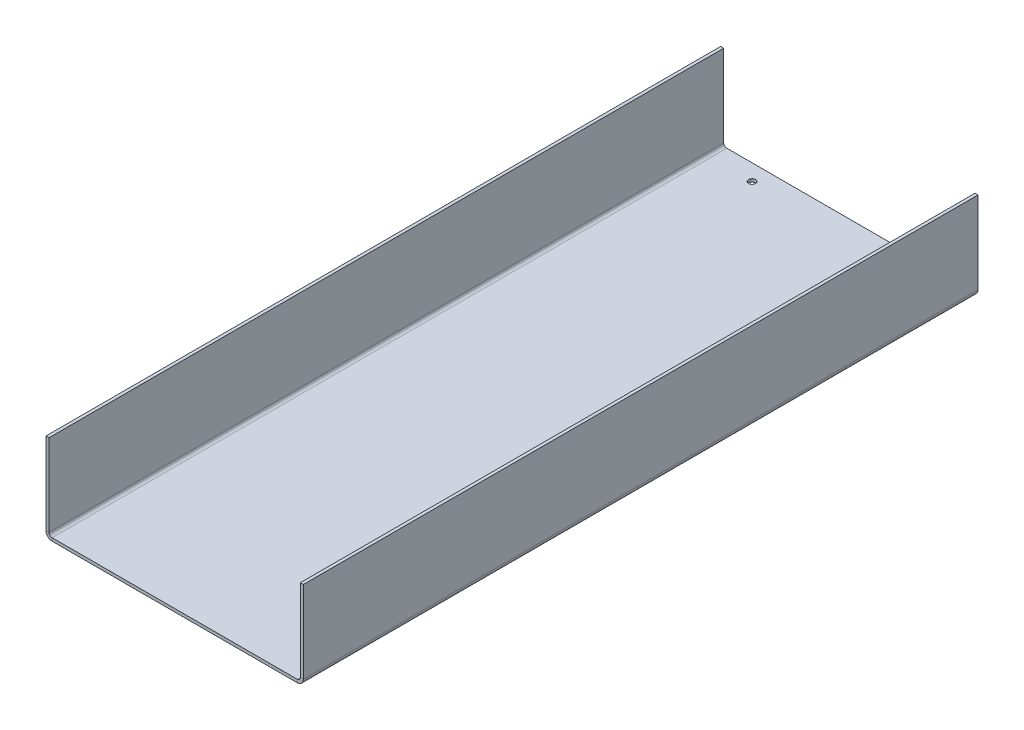
ISO-10303-21;
HEADER;
FILE_DESCRIPTION(('STEP AP214'),'2;1');
FILE_NAME('part.step','',(''),(''),'','','');
FILE_SCHEMA(('AUTOMOTIVE_DESIGN { 1 0 10303 214 1 1 1 1 }'));
ENDSEC;
DATA;
#1=APPLICATION_CONTEXT('core data for automotive mechanical design processes');
#2=APPLICATION_PROTOCOL_DEFINITION('international standard','automotive_design',2000,#1);
#3=PRODUCT_CONTEXT('',#1,'mechanical');
#4=PRODUCT('Part','Part','',(#3));
#5=PRODUCT_RELATED_PRODUCT_CATEGORY('part','',(#4));
#6=PRODUCT_DEFINITION_FORMATION('','',#4);
#7=PRODUCT_DEFINITION_CONTEXT('part definition',#1,'design');
#8=PRODUCT_DEFINITION('design','',#6,#7);
#9=PRODUCT_DEFINITION_SHAPE('','',#8);
#10=(LENGTH_UNIT() NAMED_UNIT(*) SI_UNIT(.MILLI.,.METRE.));
#11=(NAMED_UNIT(*) PLANE_ANGLE_UNIT() SI_UNIT($,.RADIAN.));
#12=(NAMED_UNIT(*) SI_UNIT($,.STERADIAN.) SOLID_ANGLE_UNIT());
#13=UNCERTAINTY_MEASURE_WITH_UNIT(LENGTH_MEASURE(1.E-05),#10,'distance_accuracy_value','');
#14=(GEOMETRIC_REPRESENTATION_CONTEXT(3) GLOBAL_UNCERTAINTY_ASSIGNED_CONTEXT((#13)) GLOBAL_UNIT_ASSIGNED_CONTEXT((#10,
#11,#12)) REPRESENTATION_CONTEXT('',''));
#15=CARTESIAN_POINT('',(0.,0.,0.));
#16=DIRECTION('',(0.,0.,1.));
#17=DIRECTION('',(1.,0.,0.));
#18=AXIS2_PLACEMENT_3D('',#15,#16,#17);
#19=CARTESIAN_POINT('',(-60.5,1.5,125.));
#20=DIRECTION('',(0.,0.,1.));
#21=DIRECTION('',(1.,0.,0.));
#22=AXIS2_PLACEMENT_3D('',#19,#20,#21);
#23=PLANE('',#22);
#24=DIRECTION('',(0.,-1.,0.));
#25=VECTOR('',#24,1.);
#26=CARTESIAN_POINT('',(-60.5,1.5,125.));
#27=LINE('',#26,#25);
#28=CARTESIAN_POINT('',(-60.5,1.5,125.));
#29=VERTEX_POINT('',#28);
#30=CARTESIAN_POINT('',(-60.5,0.,125.));
#31=VERTEX_POINT('',#30);
#32=EDGE_CURVE('E11',#29,#31,#27,.T.);
#33=ORIENTED_EDGE('',*,*,#32,.F.);
#34=CARTESIAN_POINT('',(-60.5,3.00000000000001,125.));
#35=DIRECTION('',(0.,0.,-1.));
#36=DIRECTION('',(-1.,0.,0.));
#37=AXIS2_PLACEMENT_3D('',#34,#35,#36);
#38=CIRCLE('',#37,1.5);
#39=CARTESIAN_POINT('',(-62.,3.00000000000004,125.));
#40=VERTEX_POINT('',#39);
#41=EDGE_CURVE('E203',#40,#29,#38,.F.);
#42=ORIENTED_EDGE('',*,*,#41,.F.);
#43=DIRECTION('',(1.,0.,0.));
#44=VECTOR('',#43,1.);
#45=CARTESIAN_POINT('',(-63.5,3.00000000000007,125.));
#46=LINE('',#45,#44);
#47=CARTESIAN_POINT('',(-63.5,3.00000000000007,125.));
#48=VERTEX_POINT('',#47);
#49=EDGE_CURVE('E49',#48,#40,#46,.T.);
#50=ORIENTED_EDGE('',*,*,#49,.F.);
#51=CARTESIAN_POINT('',(-60.5,3.00000000000001,125.));
#52=DIRECTION('',(0.,0.,1.));
#53=DIRECTION('',(1.,0.,0.));
#54=AXIS2_PLACEMENT_3D('',#51,#52,#53);
#55=CIRCLE('',#54,3.);
#56=EDGE_CURVE('E216',#48,#31,#55,.T.);
#57=ORIENTED_EDGE('',*,*,#56,.T.);
#58=EDGE_LOOP('',(#33,#42,#50,#57));
#59=FACE_BOUND('',#58,.T.);
#60=ADVANCED_FACE('F43',(#59),#23,.T.);
#61=CARTESIAN_POINT('',(-63.5,3.00000000000007,125.));
#62=DIRECTION('',(0.,0.,1.));
#63=DIRECTION('',(1.,0.,0.));
#64=AXIS2_PLACEMENT_3D('',#61,#62,#63);
#65=PLANE('',#64);
#66=DIRECTION('',(1.,0.,0.));
#67=VECTOR('',#66,1.);
#68=CARTESIAN_POINT('',(-62.,1.5,125.));
#69=LINE('',#68,#67);
#70=CARTESIAN_POINT('',(60.5,1.5,125.));
#71=VERTEX_POINT('',#70);
#72=EDGE_CURVE('E204',#29,#71,#69,.T.);
#73=ORIENTED_EDGE('',*,*,#72,.F.);
#74=ORIENTED_EDGE('',*,*,#32,.T.);
#75=DIRECTION('',(1.,0.,0.));
#76=VECTOR('',#75,1.);
#77=CARTESIAN_POINT('',(-62.,0.,125.));
#78=LINE('',#77,#76);
#79=CARTESIAN_POINT('',(60.5,0.,125.));
#80=VERTEX_POINT('',#79);
#81=EDGE_CURVE('E218',#31,#80,#78,.T.);
#82=ORIENTED_EDGE('',*,*,#81,.T.);
#83=DIRECTION('',(0.,1.,0.));
#84=VECTOR('',#83,1.);
#85=CARTESIAN_POINT('',(60.5,0.,125.));
#86=LINE('',#85,#84);
#87=EDGE_CURVE('E61',#80,#71,#86,.T.);
#88=ORIENTED_EDGE('',*,*,#87,.T.);
#89=EDGE_LOOP('',(#73,#74,#82,#88));
#90=FACE_BOUND('',#89,.T.);
#91=ADVANCED_FACE('F294',(#90),#65,.T.);
#92=CARTESIAN_POINT('',(-62.,3.00000000000004,-208.0001));
#93=DIRECTION('',(0.,0.,-1.));
#94=DIRECTION('',(-1.,0.,0.));
#95=AXIS2_PLACEMENT_3D('',#92,#93,#94);
#96=PLANE('',#95);
#97=DIRECTION('',(-1.,0.,0.));
#98=VECTOR('',#97,1.);
#99=CARTESIAN_POINT('',(-62.,3.00000000000004,-208.0001));
#100=LINE('',#99,#98);
#101=CARTESIAN_POINT('',(-62.,3.00000000000004,-208.0001));
#102=VERTEX_POINT('',#101);
#103=CARTESIAN_POINT('',(-63.5,3.00000000000007,-208.0001));
#104=VERTEX_POINT('',#103);
#105=EDGE_CURVE('E260',#102,#104,#100,.T.);
#106=ORIENTED_EDGE('',*,*,#105,.F.);
#107=CARTESIAN_POINT('',(-60.5,3.00000000000001,-208.0001));
#108=DIRECTION('',(0.,0.,-1.));
#109=DIRECTION('',(-1.,0.,0.));
#110=AXIS2_PLACEMENT_3D('',#107,#108,#109);
#111=CIRCLE('',#110,1.5);
#112=CARTESIAN_POINT('',(-60.5,1.5,-208.0001));
#113=VERTEX_POINT('',#112);
#114=EDGE_CURVE('E175',#102,#113,#111,.F.);
#115=ORIENTED_EDGE('',*,*,#114,.T.);
#116=DIRECTION('',(0.,1.,0.));
#117=VECTOR('',#116,1.);
#118=CARTESIAN_POINT('',(-60.5,0.,-208.0001));
#119=LINE('',#118,#117);
#120=CARTESIAN_POINT('',(-60.5,0.,-208.0001));
#121=VERTEX_POINT('',#120);
#122=EDGE_CURVE('E253',#121,#113,#119,.T.);
#123=ORIENTED_EDGE('',*,*,#122,.F.);
#124=CARTESIAN_POINT('',(-60.5,3.00000000000001,-208.0001));
#125=DIRECTION('',(0.,0.,1.));
#126=DIRECTION('',(1.,0.,0.));
#127=AXIS2_PLACEMENT_3D('',#124,#125,#126);
#128=CIRCLE('',#127,3.);
#129=EDGE_CURVE('E183',#104,#121,#128,.T.);
#130=ORIENTED_EDGE('',*,*,#129,.F.);
#131=EDGE_LOOP('',(#106,#115,#123,#130));
#132=FACE_BOUND('',#131,.T.);
#133=ADVANCED_FACE('F301',(#132),#96,.T.);
#134=CARTESIAN_POINT('',(-60.5,0.,-208.0001));
#135=DIRECTION('',(0.,0.,-1.));
#136=DIRECTION('',(-1.,0.,0.));
#137=AXIS2_PLACEMENT_3D('',#134,#135,#136);
#138=PLANE('',#137);
#139=DIRECTION('',(0.,-1.,0.));
#140=VECTOR('',#139,1.);
#141=CARTESIAN_POINT('',(-62.,43.5,-208.0001));
#142=LINE('',#141,#140);
#143=CARTESIAN_POINT('',(-62.,43.5,-208.0001));
#144=VERTEX_POINT('',#143);
#145=EDGE_CURVE('E174',#144,#102,#142,.T.);
#146=ORIENTED_EDGE('',*,*,#145,.T.);
#147=ORIENTED_EDGE('',*,*,#105,.T.);
#148=DIRECTION('',(0.,1.,0.));
#149=VECTOR('',#148,1.);
#150=CARTESIAN_POINT('',(-63.5,43.5,-208.0001));
#151=LINE('',#150,#149);
#152=CARTESIAN_POINT('',(-63.5,43.5,-208.0001));
#153=VERTEX_POINT('',#152);
#154=EDGE_CURVE('E181',#153,#104,#151,.F.);
#155=ORIENTED_EDGE('',*,*,#154,.F.);
#156=DIRECTION('',(1.,0.,0.));
#157=VECTOR('',#156,1.);
#158=CARTESIAN_POINT('',(-63.5,43.5,-208.0001));
#159=LINE('',#158,#157);
#160=EDGE_CURVE('E178',#153,#144,#159,.T.);
#161=ORIENTED_EDGE('',*,*,#160,.T.);
#162=EDGE_LOOP('',(#146,#147,#155,#161));
#163=FACE_BOUND('',#162,.T.);
#164=ADVANCED_FACE('F276',(#163),#138,.T.);
#165=CARTESIAN_POINT('',(62.,3.,125.));
#166=DIRECTION('',(0.,0.,1.));
#167=DIRECTION('',(1.,0.,0.));
#168=AXIS2_PLACEMENT_3D('',#165,#166,#167);
#169=PLANE('',#168);
#170=DIRECTION('',(1.,0.,0.));
#171=VECTOR('',#170,1.);
#172=CARTESIAN_POINT('',(62.,3.,125.));
#173=LINE('',#172,#171);
#174=CARTESIAN_POINT('',(62.,3.,125.));
#175=VERTEX_POINT('',#174);
#176=CARTESIAN_POINT('',(63.5,3.,125.));
#177=VERTEX_POINT('',#176);
#178=EDGE_CURVE('E60',#175,#177,#173,.T.);
#179=ORIENTED_EDGE('',*,*,#178,.F.);
#180=CARTESIAN_POINT('',(60.5,3.,125.));
#181=DIRECTION('',(0.,0.,-1.));
#182=DIRECTION('',(-1.,0.,0.));
#183=AXIS2_PLACEMENT_3D('',#180,#181,#182);
#184=CIRCLE('',#183,1.5);
#185=EDGE_CURVE('E199',#71,#175,#184,.F.);
#186=ORIENTED_EDGE('',*,*,#185,.F.);
#187=ORIENTED_EDGE('',*,*,#87,.F.);
#188=CARTESIAN_POINT('',(60.5,3.,125.));
#189=DIRECTION('',(0.,0.,1.));
#190=DIRECTION('',(1.,0.,0.));
#191=AXIS2_PLACEMENT_3D('',#188,#189,#190);
#192=CIRCLE('',#191,3.);
#193=EDGE_CURVE('E223',#80,#177,#192,.T.);
#194=ORIENTED_EDGE('',*,*,#193,.T.);
#195=EDGE_LOOP('',(#179,#186,#187,#194));
#196=FACE_BOUND('',#195,.T.);
#197=ADVANCED_FACE('F309',(#196),#169,.T.);
#198=CARTESIAN_POINT('',(60.5,0.,125.));
#199=DIRECTION('',(0.,0.,1.));
#200=DIRECTION('',(1.,0.,0.));
#201=AXIS2_PLACEMENT_3D('',#198,#199,#200);
#202=PLANE('',#201);
#203=DIRECTION('',(0.,1.,0.));
#204=VECTOR('',#203,1.);
#205=CARTESIAN_POINT('',(62.,1.5,125.));
#206=LINE('',#205,#204);
#207=CARTESIAN_POINT('',(62.,43.5,125.));
#208=VERTEX_POINT('',#207);
#209=EDGE_CURVE('E193',#175,#208,#206,.T.);
#210=ORIENTED_EDGE('',*,*,#209,.F.);
#211=ORIENTED_EDGE('',*,*,#178,.T.);
#212=DIRECTION('',(0.,1.,0.));
#213=VECTOR('',#212,1.);
#214=CARTESIAN_POINT('',(63.5,1.5,125.));
#215=LINE('',#214,#213);
#216=CARTESIAN_POINT('',(63.5,43.5,125.));
#217=VERTEX_POINT('',#216);
#218=EDGE_CURVE('E195',#177,#217,#215,.T.);
#219=ORIENTED_EDGE('',*,*,#218,.T.);
#220=DIRECTION('',(1.,0.,0.));
#221=VECTOR('',#220,1.);
#222=CARTESIAN_POINT('',(62.,43.5,125.));
#223=LINE('',#222,#221);
#224=EDGE_CURVE('E139',#208,#217,#223,.T.);
#225=ORIENTED_EDGE('',*,*,#224,.F.);
#226=EDGE_LOOP('',(#210,#211,#219,#225));
#227=FACE_BOUND('',#226,.T.);
#228=ADVANCED_FACE('F314',(#227),#202,.T.);
#229=CARTESIAN_POINT('',(60.5,1.5,-208.0001));
#230=DIRECTION('',(0.,0.,-1.));
#231=DIRECTION('',(-1.,0.,0.));
#232=AXIS2_PLACEMENT_3D('',#229,#230,#231);
#233=PLANE('',#232);
#234=DIRECTION('',(0.,-1.,0.));
#235=VECTOR('',#234,1.);
#236=CARTESIAN_POINT('',(60.5,1.5,-208.0001));
#237=LINE('',#236,#235);
#238=CARTESIAN_POINT('',(60.5,1.5,-208.0001));
#239=VERTEX_POINT('',#238);
#240=CARTESIAN_POINT('',(60.5,0.,-208.0001));
#241=VERTEX_POINT('',#240);
#242=EDGE_CURVE('E252',#239,#241,#237,.T.);
#243=ORIENTED_EDGE('',*,*,#242,.F.);
#244=CARTESIAN_POINT('',(60.5,3.,-208.0001));
#245=DIRECTION('',(0.,0.,-1.));
#246=DIRECTION('',(-1.,0.,0.));
#247=AXIS2_PLACEMENT_3D('',#244,#245,#246);
#248=CIRCLE('',#247,1.5);
#249=CARTESIAN_POINT('',(62.,3.,-208.0001));
#250=VERTEX_POINT('',#249);
#251=EDGE_CURVE('E168',#239,#250,#248,.F.);
#252=ORIENTED_EDGE('',*,*,#251,.T.);
#253=DIRECTION('',(-1.,0.,0.));
#254=VECTOR('',#253,1.);
#255=CARTESIAN_POINT('',(63.5,3.,-208.0001));
#256=LINE('',#255,#254);
#257=CARTESIAN_POINT('',(63.5,3.,-208.0001));
#258=VERTEX_POINT('',#257);
#259=EDGE_CURVE('E137',#258,#250,#256,.T.);
#260=ORIENTED_EDGE('',*,*,#259,.F.);
#261=CARTESIAN_POINT('',(60.5,3.,-208.0001));
#262=DIRECTION('',(0.,0.,1.));
#263=DIRECTION('',(1.,0.,0.));
#264=AXIS2_PLACEMENT_3D('',#261,#262,#263);
#265=CIRCLE('',#264,3.);
#266=EDGE_CURVE('E188',#241,#258,#265,.T.);
#267=ORIENTED_EDGE('',*,*,#266,.F.);
#268=EDGE_LOOP('',(#243,#252,#260,#267));
#269=FACE_BOUND('',#268,.T.);
#270=ADVANCED_FACE('F310',(#269),#233,.T.);
#271=CARTESIAN_POINT('',(63.5,3.,-208.0001));
#272=DIRECTION('',(0.,0.,-1.));
#273=DIRECTION('',(-1.,0.,0.));
#274=AXIS2_PLACEMENT_3D('',#271,#272,#273);
#275=PLANE('',#274);
#276=DIRECTION('',(1.,0.,0.));
#277=VECTOR('',#276,1.);
#278=CARTESIAN_POINT('',(-62.,1.5,-208.0001));
#279=LINE('',#278,#277);
#280=EDGE_CURVE('E169',#113,#239,#279,.T.);
#281=ORIENTED_EDGE('',*,*,#280,.T.);
#282=ORIENTED_EDGE('',*,*,#242,.T.);
#283=DIRECTION('',(1.,0.,0.));
#284=VECTOR('',#283,1.);
#285=CARTESIAN_POINT('',(-62.,0.,-208.0001));
#286=LINE('',#285,#284);
#287=EDGE_CURVE('E190',#121,#241,#286,.T.);
#288=ORIENTED_EDGE('',*,*,#287,.F.);
#289=ORIENTED_EDGE('',*,*,#122,.T.);
#290=EDGE_LOOP('',(#281,#282,#288,#289));
#291=FACE_BOUND('',#290,.T.);
#292=ADVANCED_FACE('F303',(#291),#275,.T.);
#293=CARTESIAN_POINT('',(63.5,1.5,125.));
#294=DIRECTION('',(-1.,0.,0.));
#295=DIRECTION('',(0.,0.,1.));
#296=AXIS2_PLACEMENT_3D('',#293,#294,#295);
#297=PLANE('',#296);
#298=DIRECTION('',(0.,0.,-1.));
#299=VECTOR('',#298,1.);
#300=CARTESIAN_POINT('',(63.5,3.,125.));
#301=LINE('',#300,#299);
#302=EDGE_CURVE('E154',#177,#258,#301,.T.);
#303=ORIENTED_EDGE('',*,*,#302,.T.);
#304=DIRECTION('',(0.,1.,0.));
#305=VECTOR('',#304,1.);
#306=CARTESIAN_POINT('',(63.5,1.5,-208.0001));
#307=LINE('',#306,#305);
#308=CARTESIAN_POINT('',(63.5,43.5,-208.0001));
#309=VERTEX_POINT('',#308);
#310=EDGE_CURVE('E150',#258,#309,#307,.T.);
#311=ORIENTED_EDGE('',*,*,#310,.T.);
#312=DIRECTION('',(0.,0.,-1.));
#313=VECTOR('',#312,1.);
#314=CARTESIAN_POINT('',(63.5,43.5,125.));
#315=LINE('',#314,#313);
#316=EDGE_CURVE('E131',#217,#309,#315,.T.);
#317=ORIENTED_EDGE('',*,*,#316,.F.);
#318=ORIENTED_EDGE('',*,*,#218,.F.);
#319=EDGE_LOOP('',(#303,#311,#317,#318));
#320=FACE_BOUND('',#319,.T.);
#321=ADVANCED_FACE('F152',(#320),#297,.F.);
#322=CARTESIAN_POINT('',(62.,43.5,125.));
#323=DIRECTION('',(0.,1.,0.));
#324=DIRECTION('',(0.,0.,1.));
#325=AXIS2_PLACEMENT_3D('',#322,#323,#324);
#326=PLANE('',#325);
#327=ORIENTED_EDGE('',*,*,#316,.T.);
#328=DIRECTION('',(1.,0.,0.));
#329=VECTOR('',#328,1.);
#330=CARTESIAN_POINT('',(62.,43.5,-208.0001));
#331=LINE('',#330,#329);
#332=CARTESIAN_POINT('',(62.,43.5,-208.0001));
#333=VERTEX_POINT('',#332);
#334=EDGE_CURVE('E133',#333,#309,#331,.T.);
#335=ORIENTED_EDGE('',*,*,#334,.F.);
#336=DIRECTION('',(0.,0.,-1.));
#337=VECTOR('',#336,1.);
#338=CARTESIAN_POINT('',(62.,43.5,125.));
#339=LINE('',#338,#337);
#340=EDGE_CURVE('E142',#208,#333,#339,.T.);
#341=ORIENTED_EDGE('',*,*,#340,.F.);
#342=ORIENTED_EDGE('',*,*,#224,.T.);
#343=EDGE_LOOP('',(#327,#335,#341,#342));
#344=FACE_BOUND('',#343,.T.);
#345=ADVANCED_FACE('F134',(#344),#326,.T.);
#346=CARTESIAN_POINT('',(62.,1.5,125.));
#347=DIRECTION('',(-1.,0.,0.));
#348=DIRECTION('',(0.,0.,1.));
#349=AXIS2_PLACEMENT_3D('',#346,#347,#348);
#350=PLANE('',#349);
#351=ORIENTED_EDGE('',*,*,#340,.T.);
#352=DIRECTION('',(0.,1.,0.));
#353=VECTOR('',#352,1.);
#354=CARTESIAN_POINT('',(62.,1.5,-208.0001));
#355=LINE('',#354,#353);
#356=EDGE_CURVE('E148',#250,#333,#355,.T.);
#357=ORIENTED_EDGE('',*,*,#356,.F.);
#358=DIRECTION('',(0.,0.,-1.));
#359=VECTOR('',#358,1.);
#360=CARTESIAN_POINT('',(62.,3.,125.));
#361=LINE('',#360,#359);
#362=EDGE_CURVE('E246',#175,#250,#361,.T.);
#363=ORIENTED_EDGE('',*,*,#362,.F.);
#364=ORIENTED_EDGE('',*,*,#209,.T.);
#365=EDGE_LOOP('',(#351,#357,#363,#364));
#366=FACE_BOUND('',#365,.T.);
#367=ADVANCED_FACE('F312',(#366),#350,.T.);
#368=CARTESIAN_POINT('',(60.5,3.,125.));
#369=DIRECTION('',(0.,0.,-1.));
#370=DIRECTION('',(-1.,0.,0.));
#371=AXIS2_PLACEMENT_3D('',#368,#369,#370);
#372=CYLINDRICAL_SURFACE('',#371,1.5);
#373=ORIENTED_EDGE('',*,*,#362,.T.);
#374=ORIENTED_EDGE('',*,*,#251,.F.);
#375=DIRECTION('',(0.,0.,-1.));
#376=VECTOR('',#375,1.);
#377=CARTESIAN_POINT('',(60.5,1.5,125.));
#378=LINE('',#377,#376);
#379=EDGE_CURVE('E243',#71,#239,#378,.T.);
#380=ORIENTED_EDGE('',*,*,#379,.F.);
#381=ORIENTED_EDGE('',*,*,#185,.T.);
#382=EDGE_LOOP('',(#373,#374,#380,#381));
#383=FACE_BOUND('',#382,.T.);
#384=ADVANCED_FACE('F317',(#383),#372,.F.);
#385=CARTESIAN_POINT('',(-62.,1.5,125.));
#386=DIRECTION('',(0.,1.,0.));
#387=DIRECTION('',(0.,0.,1.));
#388=AXIS2_PLACEMENT_3D('',#385,#386,#387);
#389=PLANE('',#388);
#390=CARTESIAN_POINT('',(40.,1.5,-200.));
#391=DIRECTION('',(0.,1.,0.));
#392=DIRECTION('',(0.,0.,1.));
#393=AXIS2_PLACEMENT_3D('',#390,#391,#392);
#394=CIRCLE('',#393,1.7);
#395=CARTESIAN_POINT('',(40.,1.5,-198.3));
#396=VERTEX_POINT('',#395);
#397=EDGE_CURVE('E158',#396,#396,#394,.T.);
#398=ORIENTED_EDGE('',*,*,#397,.F.);
#399=EDGE_LOOP('',(#398));
#400=FACE_BOUND('',#399,.T.);
#401=CARTESIAN_POINT('',(-40.,1.5,-200.));
#402=DIRECTION('',(0.,1.,0.));
#403=DIRECTION('',(0.,0.,1.));
#404=AXIS2_PLACEMENT_3D('',#401,#402,#403);
#405=CIRCLE('',#404,1.7);
#406=CARTESIAN_POINT('',(-40.,1.5,-198.3));
#407=VERTEX_POINT('',#406);
#408=EDGE_CURVE('E162',#407,#407,#405,.T.);
#409=ORIENTED_EDGE('',*,*,#408,.F.);
#410=EDGE_LOOP('',(#409));
#411=FACE_BOUND('',#410,.T.);
#412=ORIENTED_EDGE('',*,*,#379,.T.);
#413=ORIENTED_EDGE('',*,*,#280,.F.);
#414=DIRECTION('',(0.,0.,-1.));
#415=VECTOR('',#414,1.);
#416=CARTESIAN_POINT('',(-60.5,1.5,125.));
#417=LINE('',#416,#415);
#418=EDGE_CURVE('E239',#29,#113,#417,.T.);
#419=ORIENTED_EDGE('',*,*,#418,.F.);
#420=ORIENTED_EDGE('',*,*,#72,.T.);
#421=EDGE_LOOP('',(#412,#413,#419,#420));
#422=FACE_BOUND('',#421,.T.);
#423=ADVANCED_FACE('F296',(#400,#411,#422),#389,.T.);
#424=CARTESIAN_POINT('',(-60.5,3.00000000000001,125.));
#425=DIRECTION('',(0.,0.,-1.));
#426=DIRECTION('',(-1.,0.,0.));
#427=AXIS2_PLACEMENT_3D('',#424,#425,#426);
#428=CYLINDRICAL_SURFACE('',#427,1.5);
#429=ORIENTED_EDGE('',*,*,#418,.T.);
#430=ORIENTED_EDGE('',*,*,#114,.F.);
#431=DIRECTION('',(0.,0.,-1.));
#432=VECTOR('',#431,1.);
#433=CARTESIAN_POINT('',(-62.,3.00000000000004,125.));
#434=LINE('',#433,#432);
#435=EDGE_CURVE('E240',#40,#102,#434,.T.);
#436=ORIENTED_EDGE('',*,*,#435,.F.);
#437=ORIENTED_EDGE('',*,*,#41,.T.);
#438=EDGE_LOOP('',(#429,#430,#436,#437));
#439=FACE_BOUND('',#438,.T.);
#440=ADVANCED_FACE('F268',(#439),#428,.F.);
#441=CARTESIAN_POINT('',(-62.,43.5,125.));
#442=DIRECTION('',(1.,0.,0.));
#443=DIRECTION('',(0.,0.,-1.));
#444=AXIS2_PLACEMENT_3D('',#441,#442,#443);
#445=PLANE('',#444);
#446=ORIENTED_EDGE('',*,*,#435,.T.);
#447=ORIENTED_EDGE('',*,*,#145,.F.);
#448=DIRECTION('',(0.,0.,-1.));
#449=VECTOR('',#448,1.);
#450=CARTESIAN_POINT('',(-62.,43.5,125.));
#451=LINE('',#450,#449);
#452=CARTESIAN_POINT('',(-62.,43.5,125.));
#453=VERTEX_POINT('',#452);
#454=EDGE_CURVE('E232',#453,#144,#451,.T.);
#455=ORIENTED_EDGE('',*,*,#454,.F.);
#456=DIRECTION('',(0.,-1.,0.));
#457=VECTOR('',#456,1.);
#458=CARTESIAN_POINT('',(-62.,43.5,125.));
#459=LINE('',#458,#457);
#460=EDGE_CURVE('E210',#453,#40,#459,.T.);
#461=ORIENTED_EDGE('',*,*,#460,.T.);
#462=EDGE_LOOP('',(#446,#447,#455,#461));
#463=FACE_BOUND('',#462,.T.);
#464=ADVANCED_FACE('F271',(#463),#445,.T.);
#465=CARTESIAN_POINT('',(-63.5,43.5,125.));
#466=DIRECTION('',(0.,1.,0.));
#467=DIRECTION('',(0.,0.,1.));
#468=AXIS2_PLACEMENT_3D('',#465,#466,#467);
#469=PLANE('',#468);
#470=ORIENTED_EDGE('',*,*,#454,.T.);
#471=ORIENTED_EDGE('',*,*,#160,.F.);
#472=DIRECTION('',(0.,0.,-1.));
#473=VECTOR('',#472,1.);
#474=CARTESIAN_POINT('',(-63.5,43.5,125.));
#475=LINE('',#474,#473);
#476=CARTESIAN_POINT('',(-63.5,43.5,125.));
#477=VERTEX_POINT('',#476);
#478=EDGE_CURVE('E231',#477,#153,#475,.T.);
#479=ORIENTED_EDGE('',*,*,#478,.F.);
#480=DIRECTION('',(1.,0.,0.));
#481=VECTOR('',#480,1.);
#482=CARTESIAN_POINT('',(-63.5,43.5,125.));
#483=LINE('',#482,#481);
#484=EDGE_CURVE('E208',#477,#453,#483,.T.);
#485=ORIENTED_EDGE('',*,*,#484,.T.);
#486=EDGE_LOOP('',(#470,#471,#479,#485));
#487=FACE_BOUND('',#486,.T.);
#488=ADVANCED_FACE('F277',(#487),#469,.T.);
#489=CARTESIAN_POINT('',(-63.5,43.5,125.));
#490=DIRECTION('',(1.,0.,0.));
#491=DIRECTION('',(0.,0.,-1.));
#492=AXIS2_PLACEMENT_3D('',#489,#490,#491);
#493=PLANE('',#492);
#494=ORIENTED_EDGE('',*,*,#478,.T.);
#495=ORIENTED_EDGE('',*,*,#154,.T.);
#496=DIRECTION('',(0.,0.,-1.));
#497=VECTOR('',#496,1.);
#498=CARTESIAN_POINT('',(-63.5,3.00000000000007,125.));
#499=LINE('',#498,#497);
#500=EDGE_CURVE('E229',#48,#104,#499,.T.);
#501=ORIENTED_EDGE('',*,*,#500,.F.);
#502=DIRECTION('',(0.,1.,0.));
#503=VECTOR('',#502,1.);
#504=CARTESIAN_POINT('',(-63.5,43.5,125.));
#505=LINE('',#504,#503);
#506=EDGE_CURVE('E214',#477,#48,#505,.F.);
#507=ORIENTED_EDGE('',*,*,#506,.F.);
#508=EDGE_LOOP('',(#494,#495,#501,#507));
#509=FACE_BOUND('',#508,.T.);
#510=ADVANCED_FACE('F281',(#509),#493,.F.);
#511=CARTESIAN_POINT('',(-60.5,3.00000000000001,125.));
#512=DIRECTION('',(0.,0.,-1.));
#513=DIRECTION('',(-1.,0.,0.));
#514=AXIS2_PLACEMENT_3D('',#511,#512,#513);
#515=CYLINDRICAL_SURFACE('',#514,3.);
#516=ORIENTED_EDGE('',*,*,#500,.T.);
#517=ORIENTED_EDGE('',*,*,#129,.T.);
#518=DIRECTION('',(0.,0.,-1.));
#519=VECTOR('',#518,1.);
#520=CARTESIAN_POINT('',(-60.5,0.,125.));
#521=LINE('',#520,#519);
#522=EDGE_CURVE('E227',#31,#121,#521,.T.);
#523=ORIENTED_EDGE('',*,*,#522,.F.);
#524=ORIENTED_EDGE('',*,*,#56,.F.);
#525=EDGE_LOOP('',(#516,#517,#523,#524));
#526=FACE_BOUND('',#525,.T.);
#527=ADVANCED_FACE('F288',(#526),#515,.T.);
#528=CARTESIAN_POINT('',(-62.,0.,125.));
#529=DIRECTION('',(0.,1.,0.));
#530=DIRECTION('',(0.,0.,1.));
#531=AXIS2_PLACEMENT_3D('',#528,#529,#530);
#532=PLANE('',#531);
#533=CARTESIAN_POINT('',(40.,0.,-200.));
#534=DIRECTION('',(0.,1.,0.));
#535=DIRECTION('',(0.,0.,1.));
#536=AXIS2_PLACEMENT_3D('',#533,#534,#535);
#537=CIRCLE('',#536,1.7);
#538=CARTESIAN_POINT('',(40.,0.,-198.3));
#539=VERTEX_POINT('',#538);
#540=EDGE_CURVE('E159',#539,#539,#537,.T.);
#541=ORIENTED_EDGE('',*,*,#540,.T.);
#542=EDGE_LOOP('',(#541));
#543=FACE_BOUND('',#542,.T.);
#544=CARTESIAN_POINT('',(-40.,0.,-200.));
#545=DIRECTION('',(0.,1.,0.));
#546=DIRECTION('',(0.,0.,1.));
#547=AXIS2_PLACEMENT_3D('',#544,#545,#546);
#548=CIRCLE('',#547,1.7);
#549=CARTESIAN_POINT('',(-40.,0.,-198.3));
#550=VERTEX_POINT('',#549);
#551=EDGE_CURVE('E479',#550,#550,#548,.T.);
#552=ORIENTED_EDGE('',*,*,#551,.T.);
#553=EDGE_LOOP('',(#552));
#554=FACE_BOUND('',#553,.T.);
#555=ORIENTED_EDGE('',*,*,#522,.T.);
#556=ORIENTED_EDGE('',*,*,#287,.T.);
#557=DIRECTION('',(0.,0.,-1.));
#558=VECTOR('',#557,1.);
#559=CARTESIAN_POINT('',(60.5,0.,125.));
#560=LINE('',#559,#558);
#561=EDGE_CURVE('E224',#80,#241,#560,.T.);
#562=ORIENTED_EDGE('',*,*,#561,.F.);
#563=ORIENTED_EDGE('',*,*,#81,.F.);
#564=EDGE_LOOP('',(#555,#556,#562,#563));
#565=FACE_BOUND('',#564,.T.);
#566=ADVANCED_FACE('F293',(#543,#554,#565),#532,.F.);
#567=CARTESIAN_POINT('',(60.5,3.,125.));
#568=DIRECTION('',(0.,0.,-1.));
#569=DIRECTION('',(-1.,0.,0.));
#570=AXIS2_PLACEMENT_3D('',#567,#568,#569);
#571=CYLINDRICAL_SURFACE('',#570,3.);
#572=ORIENTED_EDGE('',*,*,#561,.T.);
#573=ORIENTED_EDGE('',*,*,#266,.T.);
#574=ORIENTED_EDGE('',*,*,#302,.F.);
#575=ORIENTED_EDGE('',*,*,#193,.F.);
#576=EDGE_LOOP('',(#572,#573,#574,#575));
#577=FACE_BOUND('',#576,.T.);
#578=ADVANCED_FACE('F307',(#577),#571,.T.);
#579=CARTESIAN_POINT('',(60.5,3.,125.));
#580=DIRECTION('',(0.,0.,-1.));
#581=DIRECTION('',(-1.,0.,0.));
#582=AXIS2_PLACEMENT_3D('',#579,#580,#581);
#583=PLANE('',#582);
#584=ORIENTED_EDGE('',*,*,#506,.T.);
#585=ORIENTED_EDGE('',*,*,#49,.T.);
#586=ORIENTED_EDGE('',*,*,#460,.F.);
#587=ORIENTED_EDGE('',*,*,#484,.F.);
#588=EDGE_LOOP('',(#584,#585,#586,#587));
#589=FACE_BOUND('',#588,.T.);
#590=ADVANCED_FACE('F261',(#589),#583,.F.);
#591=CARTESIAN_POINT('',(60.5,3.,-208.0001));
#592=DIRECTION('',(0.,0.,-1.));
#593=DIRECTION('',(-1.,0.,0.));
#594=AXIS2_PLACEMENT_3D('',#591,#592,#593);
#595=PLANE('',#594);
#596=ORIENTED_EDGE('',*,*,#310,.F.);
#597=ORIENTED_EDGE('',*,*,#259,.T.);
#598=ORIENTED_EDGE('',*,*,#356,.T.);
#599=ORIENTED_EDGE('',*,*,#334,.T.);
#600=EDGE_LOOP('',(#596,#597,#598,#599));
#601=FACE_BOUND('',#600,.T.);
#602=ADVANCED_FACE('F147',(#601),#595,.T.);
#603=CARTESIAN_POINT('',(-40.,1.5,-200.));
#604=DIRECTION('',(0.,-1.,0.));
#605=DIRECTION('',(0.,0.,-1.));
#606=AXIS2_PLACEMENT_3D('',#603,#604,#605);
#607=CYLINDRICAL_SURFACE('',#606,1.7);
#608=ORIENTED_EDGE('',*,*,#408,.T.);
#609=EDGE_LOOP('',(#608));
#610=FACE_BOUND('',#609,.T.);
#611=ORIENTED_EDGE('',*,*,#551,.F.);
#612=EDGE_LOOP('',(#611));
#613=FACE_BOUND('',#612,.T.);
#614=ADVANCED_FACE('F451',(#610,#613),#607,.F.);
#615=CARTESIAN_POINT('',(40.,1.5,-200.));
#616=DIRECTION('',(0.,-1.,0.));
#617=DIRECTION('',(0.,0.,-1.));
#618=AXIS2_PLACEMENT_3D('',#615,#616,#617);
#619=CYLINDRICAL_SURFACE('',#618,1.7);
#620=ORIENTED_EDGE('',*,*,#397,.T.);
#621=EDGE_LOOP('',(#620));
#622=FACE_BOUND('',#621,.T.);
#623=ORIENTED_EDGE('',*,*,#540,.F.);
#624=EDGE_LOOP('',(#623));
#625=FACE_BOUND('',#624,.T.);
#626=ADVANCED_FACE('F465',(#622,#625),#619,.F.);
#627=CLOSED_SHELL('',(#60,#91,#133,#164,#197,#228,#270,#292,#321,#345,#367,#384,#423,#440,#464,
#488,#510,#527,#566,#578,#590,#602,#614,#626));
#628=MANIFOLD_SOLID_BREP('B2',#627);
#629=ADVANCED_BREP_SHAPE_REPRESENTATION('',(#18,#628),#14);
#630=SHAPE_DEFINITION_REPRESENTATION(#9,#629);
ENDSEC;
END-ISO-10303-21;
